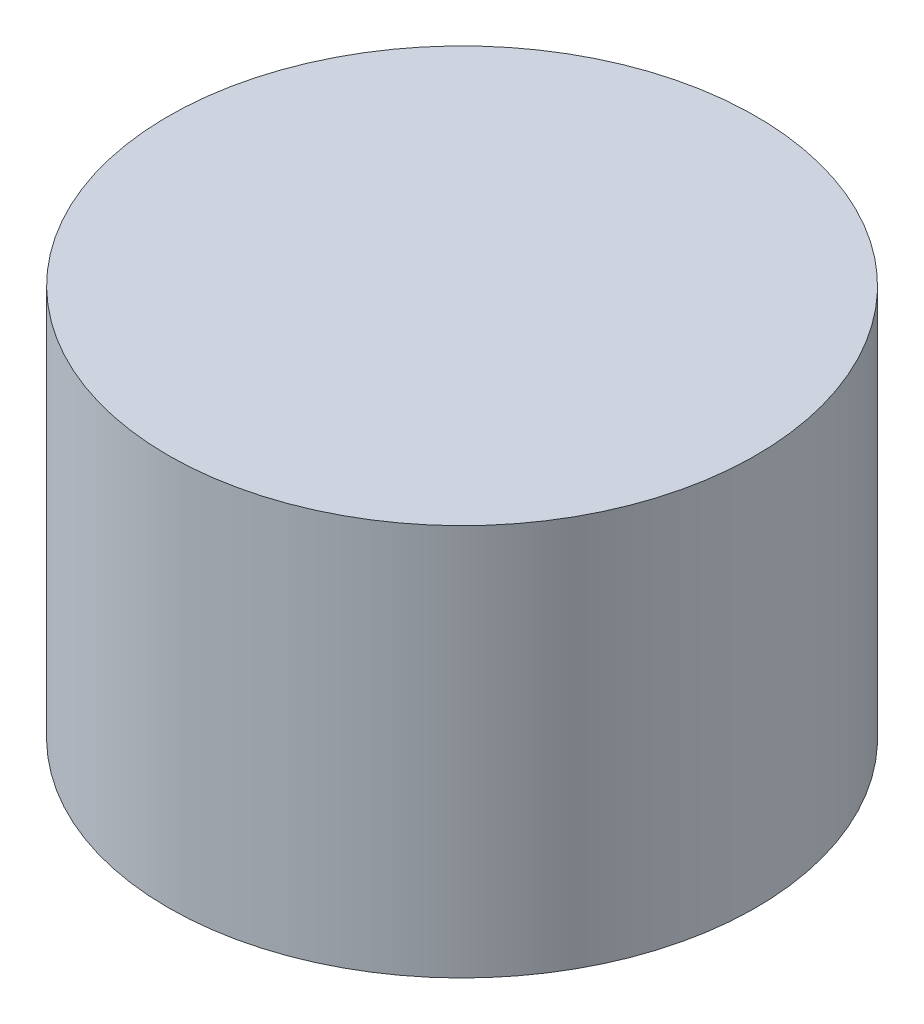
ISO-10303-21;
HEADER;
FILE_DESCRIPTION(('STEP AP214'),'2;1');
FILE_NAME('part.step','',(''),(''),'','','');
FILE_SCHEMA(('AUTOMOTIVE_DESIGN { 1 0 10303 214 1 1 1 1 }'));
ENDSEC;
DATA;
#1=APPLICATION_CONTEXT('core data for automotive mechanical design processes');
#2=APPLICATION_PROTOCOL_DEFINITION('international standard','automotive_design',2000,#1);
#3=PRODUCT_CONTEXT('',#1,'mechanical');
#4=PRODUCT('Part','Part','',(#3));
#5=PRODUCT_RELATED_PRODUCT_CATEGORY('part','',(#4));
#6=PRODUCT_DEFINITION_FORMATION('','',#4);
#7=PRODUCT_DEFINITION_CONTEXT('part definition',#1,'design');
#8=PRODUCT_DEFINITION('design','',#6,#7);
#9=PRODUCT_DEFINITION_SHAPE('','',#8);
#10=(LENGTH_UNIT() NAMED_UNIT(*) SI_UNIT(.MILLI.,.METRE.));
#11=(NAMED_UNIT(*) PLANE_ANGLE_UNIT() SI_UNIT($,.RADIAN.));
#12=(NAMED_UNIT(*) SI_UNIT($,.STERADIAN.) SOLID_ANGLE_UNIT());
#13=UNCERTAINTY_MEASURE_WITH_UNIT(LENGTH_MEASURE(1.E-05),#10,'distance_accuracy_value','');
#14=(GEOMETRIC_REPRESENTATION_CONTEXT(3) GLOBAL_UNCERTAINTY_ASSIGNED_CONTEXT((#13)) GLOBAL_UNIT_ASSIGNED_CONTEXT((#10,
#11,#12)) REPRESENTATION_CONTEXT('',''));
#15=CARTESIAN_POINT('',(0.,0.,0.));
#16=DIRECTION('',(0.,0.,1.));
#17=DIRECTION('',(1.,0.,0.));
#18=AXIS2_PLACEMENT_3D('',#15,#16,#17);
#19=CARTESIAN_POINT('',(0.,6.,0.));
#20=DIRECTION('',(0.,-1.,0.));
#21=DIRECTION('',(0.,0.,-1.));
#22=AXIS2_PLACEMENT_3D('',#19,#20,#21);
#23=CYLINDRICAL_SURFACE('',#22,4.5);
#24=CARTESIAN_POINT('',(0.,6.,0.));
#25=DIRECTION('',(0.,1.,0.));
#26=DIRECTION('',(0.,0.,1.));
#27=AXIS2_PLACEMENT_3D('',#24,#25,#26);
#28=CIRCLE('',#27,4.5);
#29=CARTESIAN_POINT('',(0.,6.,4.5));
#30=VERTEX_POINT('',#29);
#31=EDGE_CURVE('E12',#30,#30,#28,.T.);
#32=ORIENTED_EDGE('',*,*,#31,.F.);
#33=EDGE_LOOP('',(#32));
#34=FACE_BOUND('',#33,.T.);
#35=CARTESIAN_POINT('',(0.,0.,0.));
#36=DIRECTION('',(0.,1.,0.));
#37=DIRECTION('',(0.,0.,1.));
#38=AXIS2_PLACEMENT_3D('',#35,#36,#37);
#39=CIRCLE('',#38,4.5);
#40=CARTESIAN_POINT('',(0.,0.,4.5));
#41=VERTEX_POINT('',#40);
#42=EDGE_CURVE('E45',#41,#41,#39,.T.);
#43=ORIENTED_EDGE('',*,*,#42,.T.);
#44=EDGE_LOOP('',(#43));
#45=FACE_BOUND('',#44,.T.);
#46=ADVANCED_FACE('F42',(#34,#45),#23,.T.);
#47=CARTESIAN_POINT('',(0.,6.,0.));
#48=DIRECTION('',(0.,1.,0.));
#49=DIRECTION('',(0.,0.,1.));
#50=AXIS2_PLACEMENT_3D('',#47,#48,#49);
#51=PLANE('',#50);
#52=ORIENTED_EDGE('',*,*,#31,.T.);
#53=EDGE_LOOP('',(#52));
#54=FACE_BOUND('',#53,.T.);
#55=ADVANCED_FACE('F57',(#54),#51,.T.);
#56=CARTESIAN_POINT('',(0.,0.,0.));
#57=DIRECTION('',(0.,1.,0.));
#58=DIRECTION('',(0.,0.,1.));
#59=AXIS2_PLACEMENT_3D('',#56,#57,#58);
#60=PLANE('',#59);
#61=ORIENTED_EDGE('',*,*,#42,.F.);
#62=EDGE_LOOP('',(#61));
#63=FACE_BOUND('',#62,.T.);
#64=ADVANCED_FACE('F55',(#63),#60,.F.);
#65=CLOSED_SHELL('',(#46,#55,#64));
#66=MANIFOLD_SOLID_BREP('B2',#65);
#67=ADVANCED_BREP_SHAPE_REPRESENTATION('',(#18,#66),#14);
#68=SHAPE_DEFINITION_REPRESENTATION(#9,#67);
ENDSEC;
END-ISO-10303-21;
